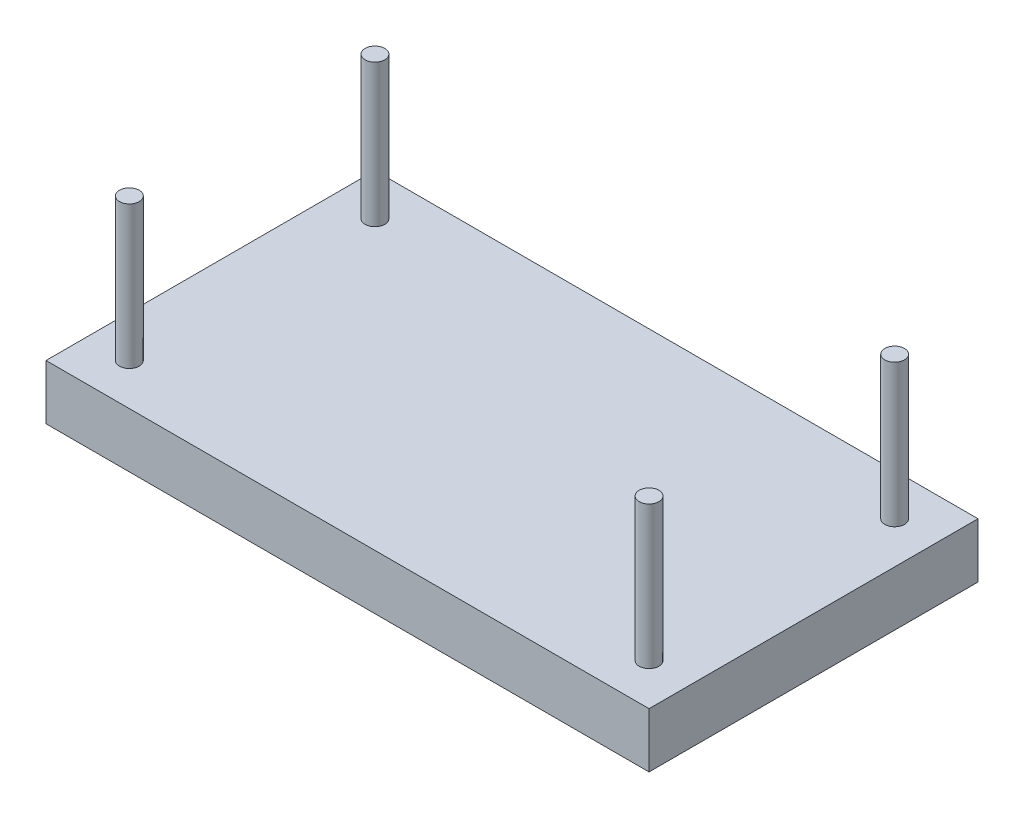
ISO-10303-21;
HEADER;
FILE_DESCRIPTION(('STEP AP214'),'2;1');
FILE_NAME('part.step','',(''),(''),'','','');
FILE_SCHEMA(('AUTOMOTIVE_DESIGN { 1 0 10303 214 1 1 1 1 }'));
ENDSEC;
DATA;
#1=APPLICATION_CONTEXT('core data for automotive mechanical design processes');
#2=APPLICATION_PROTOCOL_DEFINITION('international standard','automotive_design',2000,#1);
#3=PRODUCT_CONTEXT('',#1,'mechanical');
#4=PRODUCT('Part','Part','',(#3));
#5=PRODUCT_RELATED_PRODUCT_CATEGORY('part','',(#4));
#6=PRODUCT_DEFINITION_FORMATION('','',#4);
#7=PRODUCT_DEFINITION_CONTEXT('part definition',#1,'design');
#8=PRODUCT_DEFINITION('design','',#6,#7);
#9=PRODUCT_DEFINITION_SHAPE('','',#8);
#10=(LENGTH_UNIT() NAMED_UNIT(*) SI_UNIT(.MILLI.,.METRE.));
#11=(NAMED_UNIT(*) PLANE_ANGLE_UNIT() SI_UNIT($,.RADIAN.));
#12=(NAMED_UNIT(*) SI_UNIT($,.STERADIAN.) SOLID_ANGLE_UNIT());
#13=UNCERTAINTY_MEASURE_WITH_UNIT(LENGTH_MEASURE(1.E-05),#10,'distance_accuracy_value','');
#14=(GEOMETRIC_REPRESENTATION_CONTEXT(3) GLOBAL_UNCERTAINTY_ASSIGNED_CONTEXT((#13)) GLOBAL_UNIT_ASSIGNED_CONTEXT((#10,
#11,#12)) REPRESENTATION_CONTEXT('',''));
#15=CARTESIAN_POINT('',(0.,0.,0.));
#16=DIRECTION('',(0.,0.,1.));
#17=DIRECTION('',(1.,0.,0.));
#18=AXIS2_PLACEMENT_3D('',#15,#16,#17);
#19=CARTESIAN_POINT('',(-2.,5.,2.));
#20=DIRECTION('',(0.,0.,-1.));
#21=DIRECTION('',(-1.,0.,0.));
#22=AXIS2_PLACEMENT_3D('',#19,#20,#21);
#23=PLANE('',#22);
#24=DIRECTION('',(1.,0.,0.));
#25=VECTOR('',#24,1.);
#26=CARTESIAN_POINT('',(-2.,0.,2.));
#27=LINE('',#26,#25);
#28=CARTESIAN_POINT('',(-2.,0.,2.));
#29=VERTEX_POINT('',#28);
#30=CARTESIAN_POINT('',(53.,0.,2.));
#31=VERTEX_POINT('',#30);
#32=EDGE_CURVE('E113',#29,#31,#27,.T.);
#33=ORIENTED_EDGE('',*,*,#32,.T.);
#34=DIRECTION('',(0.,-1.,0.));
#35=VECTOR('',#34,1.);
#36=CARTESIAN_POINT('',(53.,5.,2.));
#37=LINE('',#36,#35);
#38=CARTESIAN_POINT('',(53.,5.,2.));
#39=VERTEX_POINT('',#38);
#40=EDGE_CURVE('E11',#39,#31,#37,.T.);
#41=ORIENTED_EDGE('',*,*,#40,.F.);
#42=DIRECTION('',(1.,0.,0.));
#43=VECTOR('',#42,1.);
#44=CARTESIAN_POINT('',(-2.,5.,2.));
#45=LINE('',#44,#43);
#46=CARTESIAN_POINT('',(-2.,5.,2.));
#47=VERTEX_POINT('',#46);
#48=EDGE_CURVE('E97',#47,#39,#45,.T.);
#49=ORIENTED_EDGE('',*,*,#48,.F.);
#50=DIRECTION('',(0.,-1.,0.));
#51=VECTOR('',#50,1.);
#52=CARTESIAN_POINT('',(-2.,5.,2.));
#53=LINE('',#52,#51);
#54=EDGE_CURVE('E109',#47,#29,#53,.T.);
#55=ORIENTED_EDGE('',*,*,#54,.T.);
#56=EDGE_LOOP('',(#33,#41,#49,#55));
#57=FACE_BOUND('',#56,.T.);
#58=ADVANCED_FACE('F45',(#57),#23,.F.);
#59=CARTESIAN_POINT('',(53.,5.,2.));
#60=DIRECTION('',(-1.,0.,0.));
#61=DIRECTION('',(0.,0.,1.));
#62=AXIS2_PLACEMENT_3D('',#59,#60,#61);
#63=PLANE('',#62);
#64=DIRECTION('',(0.,0.,-1.));
#65=VECTOR('',#64,1.);
#66=CARTESIAN_POINT('',(53.,0.,2.));
#67=LINE('',#66,#65);
#68=CARTESIAN_POINT('',(53.,0.,-28.));
#69=VERTEX_POINT('',#68);
#70=EDGE_CURVE('E102',#31,#69,#67,.T.);
#71=ORIENTED_EDGE('',*,*,#70,.T.);
#72=DIRECTION('',(0.,-1.,0.));
#73=VECTOR('',#72,1.);
#74=CARTESIAN_POINT('',(53.,5.,-28.));
#75=LINE('',#74,#73);
#76=CARTESIAN_POINT('',(53.,5.,-28.));
#77=VERTEX_POINT('',#76);
#78=EDGE_CURVE('E54',#77,#69,#75,.T.);
#79=ORIENTED_EDGE('',*,*,#78,.F.);
#80=DIRECTION('',(0.,0.,-1.));
#81=VECTOR('',#80,1.);
#82=CARTESIAN_POINT('',(53.,5.,2.));
#83=LINE('',#82,#81);
#84=EDGE_CURVE('E92',#39,#77,#83,.T.);
#85=ORIENTED_EDGE('',*,*,#84,.F.);
#86=ORIENTED_EDGE('',*,*,#40,.T.);
#87=EDGE_LOOP('',(#71,#79,#85,#86));
#88=FACE_BOUND('',#87,.T.);
#89=ADVANCED_FACE('F101',(#88),#63,.F.);
#90=CARTESIAN_POINT('',(-2.,5.,-28.));
#91=DIRECTION('',(0.,0.,1.));
#92=DIRECTION('',(1.,0.,0.));
#93=AXIS2_PLACEMENT_3D('',#90,#91,#92);
#94=PLANE('',#93);
#95=DIRECTION('',(-1.,0.,0.));
#96=VECTOR('',#95,1.);
#97=CARTESIAN_POINT('',(-2.,0.,-28.));
#98=LINE('',#97,#96);
#99=CARTESIAN_POINT('',(-2.,0.,-28.));
#100=VERTEX_POINT('',#99);
#101=EDGE_CURVE('E79',#69,#100,#98,.T.);
#102=ORIENTED_EDGE('',*,*,#101,.T.);
#103=DIRECTION('',(0.,-1.,0.));
#104=VECTOR('',#103,1.);
#105=CARTESIAN_POINT('',(-2.,5.,-28.));
#106=LINE('',#105,#104);
#107=CARTESIAN_POINT('',(-2.,5.,-28.));
#108=VERTEX_POINT('',#107);
#109=EDGE_CURVE('E104',#108,#100,#106,.T.);
#110=ORIENTED_EDGE('',*,*,#109,.F.);
#111=DIRECTION('',(-1.,0.,0.));
#112=VECTOR('',#111,1.);
#113=CARTESIAN_POINT('',(-2.,5.,-28.));
#114=LINE('',#113,#112);
#115=EDGE_CURVE('E95',#77,#108,#114,.T.);
#116=ORIENTED_EDGE('',*,*,#115,.F.);
#117=ORIENTED_EDGE('',*,*,#78,.T.);
#118=EDGE_LOOP('',(#102,#110,#116,#117));
#119=FACE_BOUND('',#118,.T.);
#120=ADVANCED_FACE('F105',(#119),#94,.F.);
#121=CARTESIAN_POINT('',(-2.,5.,2.));
#122=DIRECTION('',(1.,0.,0.));
#123=DIRECTION('',(0.,0.,-1.));
#124=AXIS2_PLACEMENT_3D('',#121,#122,#123);
#125=PLANE('',#124);
#126=DIRECTION('',(0.,0.,1.));
#127=VECTOR('',#126,1.);
#128=CARTESIAN_POINT('',(-2.,0.,2.));
#129=LINE('',#128,#127);
#130=EDGE_CURVE('E85',#100,#29,#129,.T.);
#131=ORIENTED_EDGE('',*,*,#130,.T.);
#132=ORIENTED_EDGE('',*,*,#54,.F.);
#133=DIRECTION('',(0.,0.,1.));
#134=VECTOR('',#133,1.);
#135=CARTESIAN_POINT('',(-2.,5.,2.));
#136=LINE('',#135,#134);
#137=EDGE_CURVE('E62',#108,#47,#136,.T.);
#138=ORIENTED_EDGE('',*,*,#137,.F.);
#139=ORIENTED_EDGE('',*,*,#109,.T.);
#140=EDGE_LOOP('',(#131,#132,#138,#139));
#141=FACE_BOUND('',#140,.T.);
#142=ADVANCED_FACE('F127',(#141),#125,.F.);
#143=CARTESIAN_POINT('',(0.,5.,0.));
#144=DIRECTION('',(0.,1.,0.));
#145=DIRECTION('',(0.,0.,1.));
#146=AXIS2_PLACEMENT_3D('',#143,#144,#145);
#147=PLANE('',#146);
#148=CARTESIAN_POINT('',(1.8,5.,-1.8));
#149=DIRECTION('',(0.,1.,0.));
#150=DIRECTION('',(0.,0.,-1.));
#151=AXIS2_PLACEMENT_3D('',#148,#149,#150);
#152=CIRCLE('',#151,0.9);
#153=CARTESIAN_POINT('',(1.8,5.,-2.7));
#154=VERTEX_POINT('',#153);
#155=EDGE_CURVE('E146',#154,#154,#152,.T.);
#156=ORIENTED_EDGE('',*,*,#155,.F.);
#157=EDGE_LOOP('',(#156));
#158=FACE_BOUND('',#157,.T.);
#159=CARTESIAN_POINT('',(49.2,5.,-1.79999999999999));
#160=DIRECTION('',(0.,1.,0.));
#161=DIRECTION('',(0.,0.,1.));
#162=AXIS2_PLACEMENT_3D('',#159,#160,#161);
#163=CIRCLE('',#162,0.899999999999997);
#164=CARTESIAN_POINT('',(49.2,5.,-2.69999999999999));
#165=VERTEX_POINT('',#164);
#166=EDGE_CURVE('E154',#165,#165,#163,.T.);
#167=ORIENTED_EDGE('',*,*,#166,.F.);
#168=EDGE_LOOP('',(#167));
#169=FACE_BOUND('',#168,.T.);
#170=CARTESIAN_POINT('',(49.2,5.,-24.2));
#171=DIRECTION('',(0.,1.,0.));
#172=DIRECTION('',(0.,0.,-1.));
#173=AXIS2_PLACEMENT_3D('',#170,#171,#172);
#174=CIRCLE('',#173,0.899999999999996);
#175=CARTESIAN_POINT('',(49.2,5.,-25.1));
#176=VERTEX_POINT('',#175);
#177=EDGE_CURVE('E138',#176,#176,#174,.T.);
#178=ORIENTED_EDGE('',*,*,#177,.F.);
#179=EDGE_LOOP('',(#178));
#180=FACE_BOUND('',#179,.T.);
#181=CARTESIAN_POINT('',(1.8,5.,-24.2));
#182=DIRECTION('',(0.,1.,0.));
#183=DIRECTION('',(0.,0.,1.));
#184=AXIS2_PLACEMENT_3D('',#181,#182,#183);
#185=CIRCLE('',#184,0.9);
#186=CARTESIAN_POINT('',(1.8,5.,-25.1));
#187=VERTEX_POINT('',#186);
#188=EDGE_CURVE('E134',#187,#187,#185,.T.);
#189=ORIENTED_EDGE('',*,*,#188,.F.);
#190=EDGE_LOOP('',(#189));
#191=FACE_BOUND('',#190,.T.);
#192=ORIENTED_EDGE('',*,*,#48,.T.);
#193=ORIENTED_EDGE('',*,*,#84,.T.);
#194=ORIENTED_EDGE('',*,*,#115,.T.);
#195=ORIENTED_EDGE('',*,*,#137,.T.);
#196=EDGE_LOOP('',(#192,#193,#194,#195));
#197=FACE_BOUND('',#196,.T.);
#198=ADVANCED_FACE('F93',(#158,#169,#180,#191,#197),#147,.T.);
#199=CARTESIAN_POINT('',(0.,0.,0.));
#200=DIRECTION('',(0.,1.,0.));
#201=DIRECTION('',(0.,0.,1.));
#202=AXIS2_PLACEMENT_3D('',#199,#200,#201);
#203=PLANE('',#202);
#204=ORIENTED_EDGE('',*,*,#32,.F.);
#205=ORIENTED_EDGE('',*,*,#130,.F.);
#206=ORIENTED_EDGE('',*,*,#101,.F.);
#207=ORIENTED_EDGE('',*,*,#70,.F.);
#208=EDGE_LOOP('',(#204,#205,#206,#207));
#209=FACE_BOUND('',#208,.T.);
#210=ADVANCED_FACE('F130',(#209),#203,.F.);
#211=CARTESIAN_POINT('',(1.8,18.,-24.2));
#212=DIRECTION('',(0.,-1.,0.));
#213=DIRECTION('',(0.,0.,-1.));
#214=AXIS2_PLACEMENT_3D('',#211,#212,#213);
#215=CYLINDRICAL_SURFACE('',#214,0.9);
#216=CARTESIAN_POINT('',(1.8,18.,-24.2));
#217=DIRECTION('',(0.,1.,0.));
#218=DIRECTION('',(0.,0.,1.));
#219=AXIS2_PLACEMENT_3D('',#216,#217,#218);
#220=CIRCLE('',#219,0.9);
#221=CARTESIAN_POINT('',(1.8,18.,-25.1));
#222=VERTEX_POINT('',#221);
#223=EDGE_CURVE('E117',#222,#222,#220,.T.);
#224=CARTESIAN_POINT('',(1.8,18.,-25.1));
#225=CARTESIAN_POINT('',(1.8,17.8645833333333,-25.1));
#226=CARTESIAN_POINT('',(1.8,17.7291666666667,-25.1));
#227=CARTESIAN_POINT('',(1.8,17.4583333333333,-25.1));
#228=CARTESIAN_POINT('',(1.8,17.3229166666667,-25.1));
#229=CARTESIAN_POINT('',(1.8,17.0520833333333,-25.1));
#230=CARTESIAN_POINT('',(1.8,16.9166666666667,-25.1));
#231=CARTESIAN_POINT('',(1.8,16.6458333333333,-25.1));
#232=CARTESIAN_POINT('',(1.8,16.5104166666667,-25.1));
#233=CARTESIAN_POINT('',(1.8,16.2395833333333,-25.1));
#234=CARTESIAN_POINT('',(1.8,16.1041666666667,-25.1));
#235=CARTESIAN_POINT('',(1.8,15.8333333333333,-25.1));
#236=CARTESIAN_POINT('',(1.8,15.6979166666667,-25.1));
#237=CARTESIAN_POINT('',(1.8,15.4270833333333,-25.1));
#238=CARTESIAN_POINT('',(1.8,15.2916666666667,-25.1));
#239=CARTESIAN_POINT('',(1.8,15.0208333333333,-25.1));
#240=CARTESIAN_POINT('',(1.8,14.8854166666667,-25.1));
#241=CARTESIAN_POINT('',(1.8,14.6145833333333,-25.1));
#242=CARTESIAN_POINT('',(1.8,14.4791666666667,-25.1));
#243=CARTESIAN_POINT('',(1.8,14.2083333333333,-25.1));
#244=CARTESIAN_POINT('',(1.8,14.0729166666667,-25.1));
#245=CARTESIAN_POINT('',(1.8,13.8020833333333,-25.1));
#246=CARTESIAN_POINT('',(1.8,13.6666666666667,-25.1));
#247=CARTESIAN_POINT('',(1.8,13.3958333333333,-25.1));
#248=CARTESIAN_POINT('',(1.8,13.2604166666667,-25.1));
#249=CARTESIAN_POINT('',(1.8,12.9895833333333,-25.1));
#250=CARTESIAN_POINT('',(1.8,12.8541666666667,-25.1));
#251=CARTESIAN_POINT('',(1.8,12.5833333333333,-25.1));
#252=CARTESIAN_POINT('',(1.8,12.4479166666667,-25.1));
#253=CARTESIAN_POINT('',(1.8,12.1770833333333,-25.1));
#254=CARTESIAN_POINT('',(1.8,12.0416666666667,-25.1));
#255=CARTESIAN_POINT('',(1.8,11.7708333333333,-25.1));
#256=CARTESIAN_POINT('',(1.8,11.6354166666667,-25.1));
#257=CARTESIAN_POINT('',(1.8,11.3645833333333,-25.1));
#258=CARTESIAN_POINT('',(1.8,11.2291666666667,-25.1));
#259=CARTESIAN_POINT('',(1.8,10.9583333333333,-25.1));
#260=CARTESIAN_POINT('',(1.8,10.8229166666667,-25.1));
#261=CARTESIAN_POINT('',(1.8,10.5520833333333,-25.1));
#262=CARTESIAN_POINT('',(1.8,10.4166666666667,-25.1));
#263=CARTESIAN_POINT('',(1.8,10.1458333333333,-25.1));
#264=CARTESIAN_POINT('',(1.8,10.0104166666667,-25.1));
#265=CARTESIAN_POINT('',(1.8,9.73958333333333,-25.1));
#266=CARTESIAN_POINT('',(1.8,9.60416666666667,-25.1));
#267=CARTESIAN_POINT('',(1.8,9.33333333333333,-25.1));
#268=CARTESIAN_POINT('',(1.8,9.19791666666667,-25.1));
#269=CARTESIAN_POINT('',(1.8,8.92708333333333,-25.1));
#270=CARTESIAN_POINT('',(1.8,8.79166666666667,-25.1));
#271=CARTESIAN_POINT('',(1.8,8.52083333333333,-25.1));
#272=CARTESIAN_POINT('',(1.8,8.38541666666667,-25.1));
#273=CARTESIAN_POINT('',(1.8,8.11458333333333,-25.1));
#274=CARTESIAN_POINT('',(1.8,7.97916666666667,-25.1));
#275=CARTESIAN_POINT('',(1.8,7.70833333333333,-25.1));
#276=CARTESIAN_POINT('',(1.8,7.57291666666667,-25.1));
#277=CARTESIAN_POINT('',(1.8,7.30208333333333,-25.1));
#278=CARTESIAN_POINT('',(1.8,7.16666666666667,-25.1));
#279=CARTESIAN_POINT('',(1.8,6.89583333333333,-25.1));
#280=CARTESIAN_POINT('',(1.8,6.76041666666667,-25.1));
#281=CARTESIAN_POINT('',(1.8,6.48958333333333,-25.1));
#282=CARTESIAN_POINT('',(1.8,6.35416666666667,-25.1));
#283=CARTESIAN_POINT('',(1.8,6.08333333333333,-25.1));
#284=CARTESIAN_POINT('',(1.8,5.94791666666667,-25.1));
#285=CARTESIAN_POINT('',(1.8,5.67708333333333,-25.1));
#286=CARTESIAN_POINT('',(1.8,5.54166666666667,-25.1));
#287=CARTESIAN_POINT('',(1.8,5.27083333333333,-25.1));
#288=CARTESIAN_POINT('',(1.8,5.13541666666667,-25.1));
#289=CARTESIAN_POINT('',(1.8,5.,-25.1));
#290=B_SPLINE_CURVE_WITH_KNOTS('',3,(#224,#225,#226,#227,#228,#229,#230,#231,#232,#233,#234,
#235,#236,#237,#238,#239,#240,#241,#242,#243,#244,#245,#246,#247,#248,#249,#250,#251,#252,#253,
#254,#255,#256,#257,#258,#259,#260,#261,#262,#263,#264,#265,#266,#267,#268,#269,#270,#271,#272,
#273,#274,#275,#276,#277,#278,#279,#280,#281,#282,#283,#284,#285,#286,#287,#288,#289),
.UNSPECIFIED.,.F.,.F.,(4,2,2,2,2,2,2,2,2,2,2,2,2,2,2,2,2,2,2,2,2,2,2,2,2,2,2,2,2,2,2,2,4),(0.,
0.40625,0.812500000000001,1.21875,1.625,2.03125,2.4375,2.84375,3.25,3.65625,4.0625,4.46875,
4.875,5.28125,5.6875,6.09375,6.5,6.90625,7.3125,7.71875,8.125,8.53125,8.9375,9.34375,9.75,
10.15625,10.5625,10.96875,11.375,11.78125,12.1875,12.59375,13.),.UNSPECIFIED.);
#291=EDGE_CURVE('BSEAM174',#222,#187,#290,.T.);
#292=ORIENTED_EDGE('',*,*,#223,.F.);
#293=ORIENTED_EDGE('',*,*,#188,.T.);
#294=ORIENTED_EDGE('',*,*,#291,.T.);
#295=ORIENTED_EDGE('',*,*,#291,.F.);
#296=EDGE_LOOP('',(#292,#294,#293,#295));
#297=FACE_BOUND('',#296,.T.);
#298=ADVANCED_FACE('F174',(#297),#215,.T.);
#299=CARTESIAN_POINT('',(1.8,18.,-24.2));
#300=DIRECTION('',(0.,1.,0.));
#301=DIRECTION('',(0.,0.,1.));
#302=AXIS2_PLACEMENT_3D('',#299,#300,#301);
#303=PLANE('',#302);
#304=ORIENTED_EDGE('',*,*,#223,.T.);
#305=EDGE_LOOP('',(#304));
#306=FACE_BOUND('',#305,.T.);
#307=ADVANCED_FACE('F176',(#306),#303,.T.);
#308=CARTESIAN_POINT('',(49.2,18.,-24.2));
#309=DIRECTION('',(0.,-1.,0.));
#310=DIRECTION('',(0.,0.,-1.));
#311=AXIS2_PLACEMENT_3D('',#308,#309,#310);
#312=CYLINDRICAL_SURFACE('',#311,0.899999999999996);
#313=CARTESIAN_POINT('',(49.2,18.,-24.2));
#314=DIRECTION('',(0.,1.,0.));
#315=DIRECTION('',(0.,0.,-1.));
#316=AXIS2_PLACEMENT_3D('',#313,#314,#315);
#317=CIRCLE('',#316,0.899999999999996);
#318=CARTESIAN_POINT('',(49.2,18.,-25.1));
#319=VERTEX_POINT('',#318);
#320=EDGE_CURVE('E158',#319,#319,#317,.T.);
#321=CARTESIAN_POINT('',(49.2,18.,-25.1));
#322=CARTESIAN_POINT('',(49.2,17.8645833333333,-25.1));
#323=CARTESIAN_POINT('',(49.2,17.7291666666667,-25.1));
#324=CARTESIAN_POINT('',(49.2,17.4583333333333,-25.1));
#325=CARTESIAN_POINT('',(49.2,17.3229166666667,-25.1));
#326=CARTESIAN_POINT('',(49.2,17.0520833333333,-25.1));
#327=CARTESIAN_POINT('',(49.2,16.9166666666667,-25.1));
#328=CARTESIAN_POINT('',(49.2,16.6458333333333,-25.1));
#329=CARTESIAN_POINT('',(49.2,16.5104166666667,-25.1));
#330=CARTESIAN_POINT('',(49.2,16.2395833333333,-25.1));
#331=CARTESIAN_POINT('',(49.2,16.1041666666667,-25.1));
#332=CARTESIAN_POINT('',(49.2,15.8333333333333,-25.1));
#333=CARTESIAN_POINT('',(49.2,15.6979166666667,-25.1));
#334=CARTESIAN_POINT('',(49.2,15.4270833333333,-25.1));
#335=CARTESIAN_POINT('',(49.2,15.2916666666667,-25.1));
#336=CARTESIAN_POINT('',(49.2,15.0208333333333,-25.1));
#337=CARTESIAN_POINT('',(49.2,14.8854166666667,-25.1));
#338=CARTESIAN_POINT('',(49.2,14.6145833333333,-25.1));
#339=CARTESIAN_POINT('',(49.2,14.4791666666667,-25.1));
#340=CARTESIAN_POINT('',(49.2,14.2083333333333,-25.1));
#341=CARTESIAN_POINT('',(49.2,14.0729166666667,-25.1));
#342=CARTESIAN_POINT('',(49.2,13.8020833333333,-25.1));
#343=CARTESIAN_POINT('',(49.2,13.6666666666667,-25.1));
#344=CARTESIAN_POINT('',(49.2,13.3958333333333,-25.1));
#345=CARTESIAN_POINT('',(49.2,13.2604166666667,-25.1));
#346=CARTESIAN_POINT('',(49.2,12.9895833333333,-25.1));
#347=CARTESIAN_POINT('',(49.2,12.8541666666667,-25.1));
#348=CARTESIAN_POINT('',(49.2,12.5833333333333,-25.1));
#349=CARTESIAN_POINT('',(49.2,12.4479166666667,-25.1));
#350=CARTESIAN_POINT('',(49.2,12.1770833333333,-25.1));
#351=CARTESIAN_POINT('',(49.2,12.0416666666667,-25.1));
#352=CARTESIAN_POINT('',(49.2,11.7708333333333,-25.1));
#353=CARTESIAN_POINT('',(49.2,11.6354166666667,-25.1));
#354=CARTESIAN_POINT('',(49.2,11.3645833333333,-25.1));
#355=CARTESIAN_POINT('',(49.2,11.2291666666667,-25.1));
#356=CARTESIAN_POINT('',(49.2,10.9583333333333,-25.1));
#357=CARTESIAN_POINT('',(49.2,10.8229166666667,-25.1));
#358=CARTESIAN_POINT('',(49.2,10.5520833333333,-25.1));
#359=CARTESIAN_POINT('',(49.2,10.4166666666667,-25.1));
#360=CARTESIAN_POINT('',(49.2,10.1458333333333,-25.1));
#361=CARTESIAN_POINT('',(49.2,10.0104166666667,-25.1));
#362=CARTESIAN_POINT('',(49.2,9.73958333333333,-25.1));
#363=CARTESIAN_POINT('',(49.2,9.60416666666667,-25.1));
#364=CARTESIAN_POINT('',(49.2,9.33333333333333,-25.1));
#365=CARTESIAN_POINT('',(49.2,9.19791666666667,-25.1));
#366=CARTESIAN_POINT('',(49.2,8.92708333333333,-25.1));
#367=CARTESIAN_POINT('',(49.2,8.79166666666667,-25.1));
#368=CARTESIAN_POINT('',(49.2,8.52083333333333,-25.1));
#369=CARTESIAN_POINT('',(49.2,8.38541666666667,-25.1));
#370=CARTESIAN_POINT('',(49.2,8.11458333333333,-25.1));
#371=CARTESIAN_POINT('',(49.2,7.97916666666667,-25.1));
#372=CARTESIAN_POINT('',(49.2,7.70833333333333,-25.1));
#373=CARTESIAN_POINT('',(49.2,7.57291666666667,-25.1));
#374=CARTESIAN_POINT('',(49.2,7.30208333333333,-25.1));
#375=CARTESIAN_POINT('',(49.2,7.16666666666667,-25.1));
#376=CARTESIAN_POINT('',(49.2,6.89583333333333,-25.1));
#377=CARTESIAN_POINT('',(49.2,6.76041666666667,-25.1));
#378=CARTESIAN_POINT('',(49.2,6.48958333333333,-25.1));
#379=CARTESIAN_POINT('',(49.2,6.35416666666667,-25.1));
#380=CARTESIAN_POINT('',(49.2,6.08333333333333,-25.1));
#381=CARTESIAN_POINT('',(49.2,5.94791666666667,-25.1));
#382=CARTESIAN_POINT('',(49.2,5.67708333333333,-25.1));
#383=CARTESIAN_POINT('',(49.2,5.54166666666667,-25.1));
#384=CARTESIAN_POINT('',(49.2,5.27083333333333,-25.1));
#385=CARTESIAN_POINT('',(49.2,5.13541666666667,-25.1));
#386=CARTESIAN_POINT('',(49.2,5.,-25.1));
#387=B_SPLINE_CURVE_WITH_KNOTS('',3,(#321,#322,#323,#324,#325,#326,#327,#328,#329,#330,#331,
#332,#333,#334,#335,#336,#337,#338,#339,#340,#341,#342,#343,#344,#345,#346,#347,#348,#349,#350,
#351,#352,#353,#354,#355,#356,#357,#358,#359,#360,#361,#362,#363,#364,#365,#366,#367,#368,#369,
#370,#371,#372,#373,#374,#375,#376,#377,#378,#379,#380,#381,#382,#383,#384,#385,#386),
.UNSPECIFIED.,.F.,.F.,(4,2,2,2,2,2,2,2,2,2,2,2,2,2,2,2,2,2,2,2,2,2,2,2,2,2,2,2,2,2,2,2,4),(0.,
0.40625,0.812500000000001,1.21875,1.625,2.03125,2.4375,2.84375,3.25,3.65625,4.0625,4.46875,
4.875,5.28125,5.6875,6.09375,6.5,6.90625,7.3125,7.71875,8.125,8.53125,8.9375,9.34375,9.75,
10.15625,10.5625,10.96875,11.375,11.78125,12.1875,12.59375,13.),.UNSPECIFIED.);
#388=EDGE_CURVE('BSEAM166',#319,#176,#387,.T.);
#389=ORIENTED_EDGE('',*,*,#320,.F.);
#390=ORIENTED_EDGE('',*,*,#177,.T.);
#391=ORIENTED_EDGE('',*,*,#388,.T.);
#392=ORIENTED_EDGE('',*,*,#388,.F.);
#393=EDGE_LOOP('',(#389,#391,#390,#392));
#394=FACE_BOUND('',#393,.T.);
#395=ADVANCED_FACE('F166',(#394),#312,.T.);
#396=CARTESIAN_POINT('',(49.2,18.,-24.2));
#397=DIRECTION('',(0.,-1.,0.));
#398=DIRECTION('',(0.,0.,-1.));
#399=AXIS2_PLACEMENT_3D('',#396,#397,#398);
#400=PLANE('',#399);
#401=ORIENTED_EDGE('',*,*,#320,.T.);
#402=EDGE_LOOP('',(#401));
#403=FACE_BOUND('',#402,.T.);
#404=ADVANCED_FACE('F232',(#403),#400,.F.);
#405=CARTESIAN_POINT('',(49.2,18.,-1.79999999999999));
#406=DIRECTION('',(0.,-1.,0.));
#407=DIRECTION('',(0.,0.,-1.));
#408=AXIS2_PLACEMENT_3D('',#405,#406,#407);
#409=CYLINDRICAL_SURFACE('',#408,0.899999999999997);
#410=CARTESIAN_POINT('',(49.2,18.,-1.79999999999999));
#411=DIRECTION('',(0.,1.,0.));
#412=DIRECTION('',(0.,0.,1.));
#413=AXIS2_PLACEMENT_3D('',#410,#411,#412);
#414=CIRCLE('',#413,0.899999999999997);
#415=CARTESIAN_POINT('',(49.2,18.,-2.69999999999999));
#416=VERTEX_POINT('',#415);
#417=EDGE_CURVE('E150',#416,#416,#414,.T.);
#418=CARTESIAN_POINT('',(49.2,18.,-2.69999999999999));
#419=CARTESIAN_POINT('',(49.2,17.8645833333333,-2.69999999999999));
#420=CARTESIAN_POINT('',(49.2,17.7291666666667,-2.69999999999999));
#421=CARTESIAN_POINT('',(49.2,17.4583333333333,-2.69999999999999));
#422=CARTESIAN_POINT('',(49.2,17.3229166666667,-2.69999999999999));
#423=CARTESIAN_POINT('',(49.2,17.0520833333333,-2.69999999999999));
#424=CARTESIAN_POINT('',(49.2,16.9166666666667,-2.69999999999999));
#425=CARTESIAN_POINT('',(49.2,16.6458333333333,-2.69999999999999));
#426=CARTESIAN_POINT('',(49.2,16.5104166666667,-2.69999999999999));
#427=CARTESIAN_POINT('',(49.2,16.2395833333333,-2.69999999999999));
#428=CARTESIAN_POINT('',(49.2,16.1041666666667,-2.69999999999999));
#429=CARTESIAN_POINT('',(49.2,15.8333333333333,-2.69999999999999));
#430=CARTESIAN_POINT('',(49.2,15.6979166666667,-2.69999999999999));
#431=CARTESIAN_POINT('',(49.2,15.4270833333333,-2.69999999999999));
#432=CARTESIAN_POINT('',(49.2,15.2916666666667,-2.69999999999999));
#433=CARTESIAN_POINT('',(49.2,15.0208333333333,-2.69999999999999));
#434=CARTESIAN_POINT('',(49.2,14.8854166666667,-2.69999999999999));
#435=CARTESIAN_POINT('',(49.2,14.6145833333333,-2.69999999999999));
#436=CARTESIAN_POINT('',(49.2,14.4791666666667,-2.69999999999999));
#437=CARTESIAN_POINT('',(49.2,14.2083333333333,-2.69999999999999));
#438=CARTESIAN_POINT('',(49.2,14.0729166666667,-2.69999999999999));
#439=CARTESIAN_POINT('',(49.2,13.8020833333333,-2.69999999999999));
#440=CARTESIAN_POINT('',(49.2,13.6666666666667,-2.69999999999999));
#441=CARTESIAN_POINT('',(49.2,13.3958333333333,-2.69999999999999));
#442=CARTESIAN_POINT('',(49.2,13.2604166666667,-2.69999999999999));
#443=CARTESIAN_POINT('',(49.2,12.9895833333333,-2.69999999999999));
#444=CARTESIAN_POINT('',(49.2,12.8541666666667,-2.69999999999999));
#445=CARTESIAN_POINT('',(49.2,12.5833333333333,-2.69999999999999));
#446=CARTESIAN_POINT('',(49.2,12.4479166666667,-2.69999999999999));
#447=CARTESIAN_POINT('',(49.2,12.1770833333333,-2.69999999999999));
#448=CARTESIAN_POINT('',(49.2,12.0416666666667,-2.69999999999999));
#449=CARTESIAN_POINT('',(49.2,11.7708333333333,-2.69999999999999));
#450=CARTESIAN_POINT('',(49.2,11.6354166666667,-2.69999999999999));
#451=CARTESIAN_POINT('',(49.2,11.3645833333333,-2.69999999999999));
#452=CARTESIAN_POINT('',(49.2,11.2291666666667,-2.69999999999999));
#453=CARTESIAN_POINT('',(49.2,10.9583333333333,-2.69999999999999));
#454=CARTESIAN_POINT('',(49.2,10.8229166666667,-2.69999999999999));
#455=CARTESIAN_POINT('',(49.2,10.5520833333333,-2.69999999999999));
#456=CARTESIAN_POINT('',(49.2,10.4166666666667,-2.69999999999999));
#457=CARTESIAN_POINT('',(49.2,10.1458333333333,-2.69999999999999));
#458=CARTESIAN_POINT('',(49.2,10.0104166666667,-2.69999999999999));
#459=CARTESIAN_POINT('',(49.2,9.73958333333333,-2.69999999999999));
#460=CARTESIAN_POINT('',(49.2,9.60416666666667,-2.69999999999999));
#461=CARTESIAN_POINT('',(49.2,9.33333333333333,-2.69999999999999));
#462=CARTESIAN_POINT('',(49.2,9.19791666666667,-2.69999999999999));
#463=CARTESIAN_POINT('',(49.2,8.92708333333333,-2.69999999999999));
#464=CARTESIAN_POINT('',(49.2,8.79166666666667,-2.69999999999999));
#465=CARTESIAN_POINT('',(49.2,8.52083333333333,-2.69999999999999));
#466=CARTESIAN_POINT('',(49.2,8.38541666666667,-2.69999999999999));
#467=CARTESIAN_POINT('',(49.2,8.11458333333333,-2.69999999999999));
#468=CARTESIAN_POINT('',(49.2,7.97916666666667,-2.69999999999999));
#469=CARTESIAN_POINT('',(49.2,7.70833333333333,-2.69999999999999));
#470=CARTESIAN_POINT('',(49.2,7.57291666666667,-2.69999999999999));
#471=CARTESIAN_POINT('',(49.2,7.30208333333333,-2.69999999999999));
#472=CARTESIAN_POINT('',(49.2,7.16666666666667,-2.69999999999999));
#473=CARTESIAN_POINT('',(49.2,6.89583333333333,-2.69999999999999));
#474=CARTESIAN_POINT('',(49.2,6.76041666666667,-2.69999999999999));
#475=CARTESIAN_POINT('',(49.2,6.48958333333333,-2.69999999999999));
#476=CARTESIAN_POINT('',(49.2,6.35416666666667,-2.69999999999999));
#477=CARTESIAN_POINT('',(49.2,6.08333333333333,-2.69999999999999));
#478=CARTESIAN_POINT('',(49.2,5.94791666666667,-2.69999999999999));
#479=CARTESIAN_POINT('',(49.2,5.67708333333333,-2.69999999999999));
#480=CARTESIAN_POINT('',(49.2,5.54166666666667,-2.69999999999999));
#481=CARTESIAN_POINT('',(49.2,5.27083333333333,-2.69999999999999));
#482=CARTESIAN_POINT('',(49.2,5.13541666666667,-2.69999999999999));
#483=CARTESIAN_POINT('',(49.2,5.,-2.69999999999999));
#484=B_SPLINE_CURVE_WITH_KNOTS('',3,(#418,#419,#420,#421,#422,#423,#424,#425,#426,#427,#428,
#429,#430,#431,#432,#433,#434,#435,#436,#437,#438,#439,#440,#441,#442,#443,#444,#445,#446,#447,
#448,#449,#450,#451,#452,#453,#454,#455,#456,#457,#458,#459,#460,#461,#462,#463,#464,#465,#466,
#467,#468,#469,#470,#471,#472,#473,#474,#475,#476,#477,#478,#479,#480,#481,#482,#483),
.UNSPECIFIED.,.F.,.F.,(4,2,2,2,2,2,2,2,2,2,2,2,2,2,2,2,2,2,2,2,2,2,2,2,2,2,2,2,2,2,2,2,4),(0.,
0.40625,0.812500000000001,1.21875,1.625,2.03125,2.4375,2.84375,3.25,3.65625,4.0625,4.46875,
4.875,5.28125,5.6875,6.09375,6.5,6.90625,7.3125,7.71875,8.125,8.53125,8.9375,9.34375,9.75,
10.15625,10.5625,10.96875,11.375,11.78125,12.1875,12.59375,13.),.UNSPECIFIED.);
#485=EDGE_CURVE('BSEAM241',#416,#165,#484,.T.);
#486=ORIENTED_EDGE('',*,*,#417,.F.);
#487=ORIENTED_EDGE('',*,*,#166,.T.);
#488=ORIENTED_EDGE('',*,*,#485,.T.);
#489=ORIENTED_EDGE('',*,*,#485,.F.);
#490=EDGE_LOOP('',(#486,#488,#487,#489));
#491=FACE_BOUND('',#490,.T.);
#492=ADVANCED_FACE('F241',(#491),#409,.T.);
#493=CARTESIAN_POINT('',(49.2,18.,-1.79999999999999));
#494=DIRECTION('',(0.,1.,0.));
#495=DIRECTION('',(0.,0.,1.));
#496=AXIS2_PLACEMENT_3D('',#493,#494,#495);
#497=PLANE('',#496);
#498=ORIENTED_EDGE('',*,*,#417,.T.);
#499=EDGE_LOOP('',(#498));
#500=FACE_BOUND('',#499,.T.);
#501=ADVANCED_FACE('F250',(#500),#497,.T.);
#502=CARTESIAN_POINT('',(1.8,18.,-1.8));
#503=DIRECTION('',(0.,-1.,0.));
#504=DIRECTION('',(0.,0.,-1.));
#505=AXIS2_PLACEMENT_3D('',#502,#503,#504);
#506=CYLINDRICAL_SURFACE('',#505,0.9);
#507=CARTESIAN_POINT('',(1.8,18.,-1.8));
#508=DIRECTION('',(0.,1.,0.));
#509=DIRECTION('',(0.,0.,-1.));
#510=AXIS2_PLACEMENT_3D('',#507,#508,#509);
#511=CIRCLE('',#510,0.9);
#512=CARTESIAN_POINT('',(1.8,18.,-2.7));
#513=VERTEX_POINT('',#512);
#514=EDGE_CURVE('E142',#513,#513,#511,.T.);
#515=CARTESIAN_POINT('',(1.8,18.,-2.7));
#516=CARTESIAN_POINT('',(1.8,17.8645833333333,-2.7));
#517=CARTESIAN_POINT('',(1.8,17.7291666666667,-2.7));
#518=CARTESIAN_POINT('',(1.8,17.4583333333333,-2.7));
#519=CARTESIAN_POINT('',(1.8,17.3229166666667,-2.7));
#520=CARTESIAN_POINT('',(1.8,17.0520833333333,-2.7));
#521=CARTESIAN_POINT('',(1.8,16.9166666666667,-2.7));
#522=CARTESIAN_POINT('',(1.8,16.6458333333333,-2.7));
#523=CARTESIAN_POINT('',(1.8,16.5104166666667,-2.7));
#524=CARTESIAN_POINT('',(1.8,16.2395833333333,-2.7));
#525=CARTESIAN_POINT('',(1.8,16.1041666666667,-2.7));
#526=CARTESIAN_POINT('',(1.8,15.8333333333333,-2.7));
#527=CARTESIAN_POINT('',(1.8,15.6979166666667,-2.7));
#528=CARTESIAN_POINT('',(1.8,15.4270833333333,-2.7));
#529=CARTESIAN_POINT('',(1.8,15.2916666666667,-2.7));
#530=CARTESIAN_POINT('',(1.8,15.0208333333333,-2.7));
#531=CARTESIAN_POINT('',(1.8,14.8854166666667,-2.7));
#532=CARTESIAN_POINT('',(1.8,14.6145833333333,-2.7));
#533=CARTESIAN_POINT('',(1.8,14.4791666666667,-2.7));
#534=CARTESIAN_POINT('',(1.8,14.2083333333333,-2.7));
#535=CARTESIAN_POINT('',(1.8,14.0729166666667,-2.7));
#536=CARTESIAN_POINT('',(1.8,13.8020833333333,-2.7));
#537=CARTESIAN_POINT('',(1.8,13.6666666666667,-2.7));
#538=CARTESIAN_POINT('',(1.8,13.3958333333333,-2.7));
#539=CARTESIAN_POINT('',(1.8,13.2604166666667,-2.7));
#540=CARTESIAN_POINT('',(1.8,12.9895833333333,-2.7));
#541=CARTESIAN_POINT('',(1.8,12.8541666666667,-2.7));
#542=CARTESIAN_POINT('',(1.8,12.5833333333333,-2.7));
#543=CARTESIAN_POINT('',(1.8,12.4479166666667,-2.7));
#544=CARTESIAN_POINT('',(1.8,12.1770833333333,-2.7));
#545=CARTESIAN_POINT('',(1.8,12.0416666666667,-2.7));
#546=CARTESIAN_POINT('',(1.8,11.7708333333333,-2.7));
#547=CARTESIAN_POINT('',(1.8,11.6354166666667,-2.7));
#548=CARTESIAN_POINT('',(1.8,11.3645833333333,-2.7));
#549=CARTESIAN_POINT('',(1.8,11.2291666666667,-2.7));
#550=CARTESIAN_POINT('',(1.8,10.9583333333333,-2.7));
#551=CARTESIAN_POINT('',(1.8,10.8229166666667,-2.7));
#552=CARTESIAN_POINT('',(1.8,10.5520833333333,-2.7));
#553=CARTESIAN_POINT('',(1.8,10.4166666666667,-2.7));
#554=CARTESIAN_POINT('',(1.8,10.1458333333333,-2.7));
#555=CARTESIAN_POINT('',(1.8,10.0104166666667,-2.7));
#556=CARTESIAN_POINT('',(1.8,9.73958333333333,-2.7));
#557=CARTESIAN_POINT('',(1.8,9.60416666666667,-2.7));
#558=CARTESIAN_POINT('',(1.8,9.33333333333333,-2.7));
#559=CARTESIAN_POINT('',(1.8,9.19791666666667,-2.7));
#560=CARTESIAN_POINT('',(1.8,8.92708333333333,-2.7));
#561=CARTESIAN_POINT('',(1.8,8.79166666666667,-2.7));
#562=CARTESIAN_POINT('',(1.8,8.52083333333333,-2.7));
#563=CARTESIAN_POINT('',(1.8,8.38541666666667,-2.7));
#564=CARTESIAN_POINT('',(1.8,8.11458333333333,-2.7));
#565=CARTESIAN_POINT('',(1.8,7.97916666666667,-2.7));
#566=CARTESIAN_POINT('',(1.8,7.70833333333333,-2.7));
#567=CARTESIAN_POINT('',(1.8,7.57291666666667,-2.7));
#568=CARTESIAN_POINT('',(1.8,7.30208333333333,-2.7));
#569=CARTESIAN_POINT('',(1.8,7.16666666666667,-2.7));
#570=CARTESIAN_POINT('',(1.8,6.89583333333333,-2.7));
#571=CARTESIAN_POINT('',(1.8,6.76041666666667,-2.7));
#572=CARTESIAN_POINT('',(1.8,6.48958333333333,-2.7));
#573=CARTESIAN_POINT('',(1.8,6.35416666666667,-2.7));
#574=CARTESIAN_POINT('',(1.8,6.08333333333333,-2.7));
#575=CARTESIAN_POINT('',(1.8,5.94791666666667,-2.7));
#576=CARTESIAN_POINT('',(1.8,5.67708333333333,-2.7));
#577=CARTESIAN_POINT('',(1.8,5.54166666666667,-2.7));
#578=CARTESIAN_POINT('',(1.8,5.27083333333333,-2.7));
#579=CARTESIAN_POINT('',(1.8,5.13541666666667,-2.7));
#580=CARTESIAN_POINT('',(1.8,5.,-2.7));
#581=B_SPLINE_CURVE_WITH_KNOTS('',3,(#515,#516,#517,#518,#519,#520,#521,#522,#523,#524,#525,
#526,#527,#528,#529,#530,#531,#532,#533,#534,#535,#536,#537,#538,#539,#540,#541,#542,#543,#544,
#545,#546,#547,#548,#549,#550,#551,#552,#553,#554,#555,#556,#557,#558,#559,#560,#561,#562,#563,
#564,#565,#566,#567,#568,#569,#570,#571,#572,#573,#574,#575,#576,#577,#578,#579,#580),
.UNSPECIFIED.,.F.,.F.,(4,2,2,2,2,2,2,2,2,2,2,2,2,2,2,2,2,2,2,2,2,2,2,2,2,2,2,2,2,2,2,2,4),(0.,
0.40625,0.812500000000001,1.21875,1.625,2.03125,2.4375,2.84375,3.25,3.65625,4.0625,4.46875,
4.875,5.28125,5.6875,6.09375,6.5,6.90625,7.3125,7.71875,8.125,8.53125,8.9375,9.34375,9.75,
10.15625,10.5625,10.96875,11.375,11.78125,12.1875,12.59375,13.),.UNSPECIFIED.);
#582=EDGE_CURVE('BSEAM259',#513,#154,#581,.T.);
#583=ORIENTED_EDGE('',*,*,#514,.F.);
#584=ORIENTED_EDGE('',*,*,#155,.T.);
#585=ORIENTED_EDGE('',*,*,#582,.T.);
#586=ORIENTED_EDGE('',*,*,#582,.F.);
#587=EDGE_LOOP('',(#583,#585,#584,#586));
#588=FACE_BOUND('',#587,.T.);
#589=ADVANCED_FACE('F259',(#588),#506,.T.);
#590=CARTESIAN_POINT('',(1.8,18.,-1.8));
#591=DIRECTION('',(0.,-1.,0.));
#592=DIRECTION('',(0.,0.,-1.));
#593=AXIS2_PLACEMENT_3D('',#590,#591,#592);
#594=PLANE('',#593);
#595=ORIENTED_EDGE('',*,*,#514,.T.);
#596=EDGE_LOOP('',(#595));
#597=FACE_BOUND('',#596,.T.);
#598=ADVANCED_FACE('F268',(#597),#594,.F.);
#599=CLOSED_SHELL('',(#58,#89,#120,#142,#198,#210,#298,#307,#395,#404,#492,#501,#589,#598));
#600=MANIFOLD_SOLID_BREP('B2',#599);
#601=ADVANCED_BREP_SHAPE_REPRESENTATION('',(#18,#600),#14);
#602=SHAPE_DEFINITION_REPRESENTATION(#9,#601);
ENDSEC;
END-ISO-10303-21;
